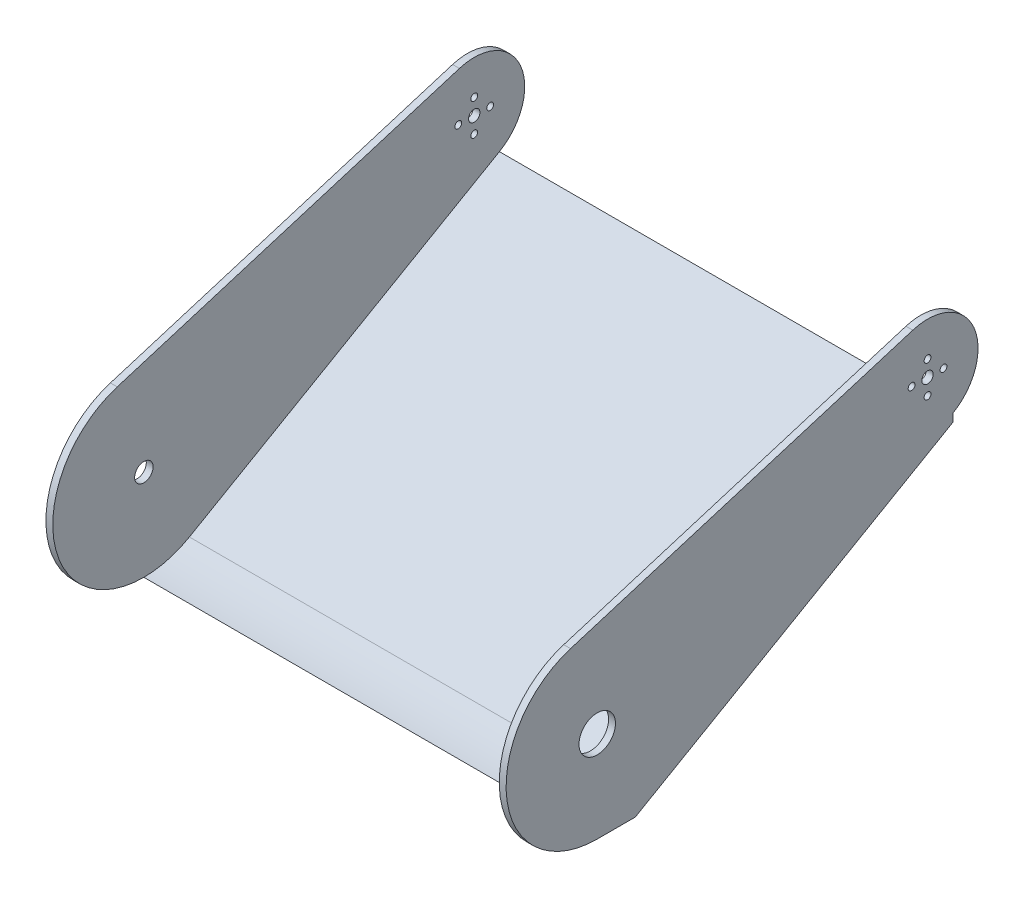
ISO-10303-21;
HEADER;
FILE_DESCRIPTION(('STEP AP214'),'2;1');
FILE_NAME('part.step','',(''),(''),'','','');
FILE_SCHEMA(('AUTOMOTIVE_DESIGN { 1 0 10303 214 1 1 1 1 }'));
ENDSEC;
DATA;
#1=APPLICATION_CONTEXT('core data for automotive mechanical design processes');
#2=APPLICATION_PROTOCOL_DEFINITION('international standard','automotive_design',2000,#1);
#3=PRODUCT_CONTEXT('',#1,'mechanical');
#4=PRODUCT('Part','Part','',(#3));
#5=PRODUCT_RELATED_PRODUCT_CATEGORY('part','',(#4));
#6=PRODUCT_DEFINITION_FORMATION('','',#4);
#7=PRODUCT_DEFINITION_CONTEXT('part definition',#1,'design');
#8=PRODUCT_DEFINITION('design','',#6,#7);
#9=PRODUCT_DEFINITION_SHAPE('','',#8);
#10=(LENGTH_UNIT() NAMED_UNIT(*) SI_UNIT(.MILLI.,.METRE.));
#11=(NAMED_UNIT(*) PLANE_ANGLE_UNIT() SI_UNIT($,.RADIAN.));
#12=(NAMED_UNIT(*) SI_UNIT($,.STERADIAN.) SOLID_ANGLE_UNIT());
#13=UNCERTAINTY_MEASURE_WITH_UNIT(LENGTH_MEASURE(1.E-05),#10,'distance_accuracy_value','');
#14=(GEOMETRIC_REPRESENTATION_CONTEXT(3) GLOBAL_UNCERTAINTY_ASSIGNED_CONTEXT((#13)) GLOBAL_UNIT_ASSIGNED_CONTEXT((#10,
#11,#12)) REPRESENTATION_CONTEXT('',''));
#15=CARTESIAN_POINT('',(0.,0.,0.));
#16=DIRECTION('',(0.,0.,1.));
#17=DIRECTION('',(1.,0.,0.));
#18=AXIS2_PLACEMENT_3D('',#15,#16,#17);
#19=CARTESIAN_POINT('',(3.,63.,-145.));
#20=DIRECTION('',(-1.,0.,0.));
#21=DIRECTION('',(0.,0.,1.));
#22=AXIS2_PLACEMENT_3D('',#19,#20,#21);
#23=CYLINDRICAL_SURFACE('',#22,22.1703860683274);
#24=CARTESIAN_POINT('',(0.,63.,-145.));
#25=DIRECTION('',(1.,0.,0.));
#26=DIRECTION('',(0.,0.,-1.));
#27=AXIS2_PLACEMENT_3D('',#24,#25,#26);
#28=CIRCLE('',#27,22.1703860683274);
#29=CARTESIAN_POINT('',(0.,43.7920690464924,-156.071648788865));
#30=VERTEX_POINT('',#29);
#31=CARTESIAN_POINT('',(0.,84.2006679089215,-138.51480928312));
#32=VERTEX_POINT('',#31);
#33=EDGE_CURVE('E249',#30,#32,#28,.T.);
#34=ORIENTED_EDGE('',*,*,#33,.T.);
#35=DIRECTION('',(-1.,0.,0.));
#36=VECTOR('',#35,1.);
#37=CARTESIAN_POINT('',(3.,84.2006679089215,-138.51480928312));
#38=LINE('',#37,#36);
#39=CARTESIAN_POINT('',(3.,84.2006679089215,-138.51480928312));
#40=VERTEX_POINT('',#39);
#41=EDGE_CURVE('E11',#40,#32,#38,.T.);
#42=ORIENTED_EDGE('',*,*,#41,.F.);
#43=CARTESIAN_POINT('',(3.,63.,-145.));
#44=DIRECTION('',(1.,0.,0.));
#45=DIRECTION('',(0.,0.,-1.));
#46=AXIS2_PLACEMENT_3D('',#43,#44,#45);
#47=CIRCLE('',#46,22.1703860683274);
#48=CARTESIAN_POINT('',(3.,43.7920690464924,-156.071648788865));
#49=VERTEX_POINT('',#48);
#50=EDGE_CURVE('E91',#49,#40,#47,.T.);
#51=ORIENTED_EDGE('',*,*,#50,.F.);
#52=DIRECTION('',(-1.,0.,0.));
#53=VECTOR('',#52,1.);
#54=CARTESIAN_POINT('',(3.,43.7920690464924,-156.071648788865));
#55=LINE('',#54,#53);
#56=EDGE_CURVE('E87',#49,#30,#55,.T.);
#57=ORIENTED_EDGE('',*,*,#56,.T.);
#58=EDGE_LOOP('',(#34,#42,#51,#57));
#59=FACE_BOUND('',#58,.T.);
#60=ADVANCED_FACE('F39',(#59),#23,.T.);
#61=CARTESIAN_POINT('',(3.,38.2504262101395,11.7006365101509));
#62=DIRECTION('',(0.,0.956260655253487,0.292515912753773));
#63=DIRECTION('',(0.,-0.292515912753773,0.956260655253487));
#64=AXIS2_PLACEMENT_3D('',#61,#62,#63);
#65=PLANE('',#64);
#66=DIRECTION('',(0.,0.292515912753773,-0.956260655253487));
#67=VECTOR('',#66,1.);
#68=CARTESIAN_POINT('',(0.,38.2504262101395,11.7006365101509));
#69=LINE('',#68,#67);
#70=CARTESIAN_POINT('',(0.,38.2504262101395,11.7006365101509));
#71=VERTEX_POINT('',#70);
#72=EDGE_CURVE('E251',#71,#32,#69,.T.);
#73=ORIENTED_EDGE('',*,*,#72,.F.);
#74=DIRECTION('',(-1.,0.,0.));
#75=VECTOR('',#74,1.);
#76=CARTESIAN_POINT('',(3.,38.2504262101395,11.7006365101509));
#77=LINE('',#76,#75);
#78=CARTESIAN_POINT('',(3.,38.2504262101395,11.7006365101509));
#79=VERTEX_POINT('',#78);
#80=EDGE_CURVE('E48',#79,#71,#77,.T.);
#81=ORIENTED_EDGE('',*,*,#80,.F.);
#82=DIRECTION('',(0.,0.292515912753773,-0.956260655253487));
#83=VECTOR('',#82,1.);
#84=CARTESIAN_POINT('',(3.,38.2504262101395,11.7006365101509));
#85=LINE('',#84,#83);
#86=EDGE_CURVE('E230',#79,#40,#85,.T.);
#87=ORIENTED_EDGE('',*,*,#86,.T.);
#88=ORIENTED_EDGE('',*,*,#41,.T.);
#89=EDGE_LOOP('',(#73,#81,#87,#88));
#90=FACE_BOUND('',#89,.T.);
#91=ADVANCED_FACE('F280',(#90),#65,.T.);
#92=CARTESIAN_POINT('',(3.,0.,0.));
#93=DIRECTION('',(-1.,0.,0.));
#94=DIRECTION('',(0.,0.,1.));
#95=AXIS2_PLACEMENT_3D('',#92,#93,#94);
#96=CYLINDRICAL_SURFACE('',#95,40.);
#97=CARTESIAN_POINT('',(0.,0.,0.));
#98=DIRECTION('',(1.,0.,0.));
#99=DIRECTION('',(0.,0.,-1.));
#100=AXIS2_PLACEMENT_3D('',#97,#98,#99);
#101=CIRCLE('',#100,40.);
#102=CARTESIAN_POINT('',(0.,-40.,0.));
#103=VERTEX_POINT('',#102);
#104=EDGE_CURVE('E254',#71,#103,#101,.T.);
#105=ORIENTED_EDGE('',*,*,#104,.T.);
#106=DIRECTION('',(-1.,0.,0.));
#107=VECTOR('',#106,1.);
#108=CARTESIAN_POINT('',(3.,-40.,0.));
#109=LINE('',#108,#107);
#110=CARTESIAN_POINT('',(3.,-40.,0.));
#111=VERTEX_POINT('',#110);
#112=EDGE_CURVE('E267',#111,#103,#109,.T.);
#113=ORIENTED_EDGE('',*,*,#112,.F.);
#114=CARTESIAN_POINT('',(3.,0.,0.));
#115=DIRECTION('',(1.,0.,0.));
#116=DIRECTION('',(0.,0.,-1.));
#117=AXIS2_PLACEMENT_3D('',#114,#115,#116);
#118=CIRCLE('',#117,40.);
#119=EDGE_CURVE('E233',#79,#111,#118,.T.);
#120=ORIENTED_EDGE('',*,*,#119,.F.);
#121=ORIENTED_EDGE('',*,*,#80,.T.);
#122=EDGE_LOOP('',(#105,#113,#120,#121));
#123=FACE_BOUND('',#122,.T.);
#124=ADVANCED_FACE('F272',(#123),#96,.T.);
#125=CARTESIAN_POINT('',(3.,-40.,0.));
#126=DIRECTION('',(0.,1.,0.));
#127=DIRECTION('',(0.,0.,1.));
#128=AXIS2_PLACEMENT_3D('',#125,#126,#127);
#129=PLANE('',#128);
#130=DIRECTION('',(0.,0.,-1.));
#131=VECTOR('',#130,1.);
#132=CARTESIAN_POINT('',(0.,-40.,0.));
#133=LINE('',#132,#131);
#134=CARTESIAN_POINT('',(0.,-40.,-16.7101907155731));
#135=VERTEX_POINT('',#134);
#136=EDGE_CURVE('E256',#103,#135,#133,.T.);
#137=ORIENTED_EDGE('',*,*,#136,.T.);
#138=DIRECTION('',(-1.,0.,0.));
#139=VECTOR('',#138,1.);
#140=CARTESIAN_POINT('',(3.,-40.,-16.7101907155731));
#141=LINE('',#140,#139);
#142=CARTESIAN_POINT('',(202.,-40.,-16.7101907155731));
#143=VERTEX_POINT('',#142);
#144=EDGE_CURVE('E264',#143,#135,#141,.T.);
#145=ORIENTED_EDGE('',*,*,#144,.F.);
#146=DIRECTION('',(0.,0.,-1.));
#147=VECTOR('',#146,1.);
#148=CARTESIAN_POINT('',(202.,-40.,0.));
#149=LINE('',#148,#147);
#150=CARTESIAN_POINT('',(202.,-40.,0.));
#151=VERTEX_POINT('',#150);
#152=EDGE_CURVE('E185',#151,#143,#149,.T.);
#153=ORIENTED_EDGE('',*,*,#152,.F.);
#154=DIRECTION('',(1.,0.,0.));
#155=VECTOR('',#154,1.);
#156=CARTESIAN_POINT('',(199.,-40.,0.));
#157=LINE('',#156,#155);
#158=CARTESIAN_POINT('',(199.,-40.,0.));
#159=VERTEX_POINT('',#158);
#160=EDGE_CURVE('E140',#159,#151,#157,.T.);
#161=ORIENTED_EDGE('',*,*,#160,.F.);
#162=DIRECTION('',(-1.,0.,0.));
#163=VECTOR('',#162,1.);
#164=CARTESIAN_POINT('',(199.,-40.,0.));
#165=LINE('',#164,#163);
#166=EDGE_CURVE('E209',#159,#111,#165,.T.);
#167=ORIENTED_EDGE('',*,*,#166,.T.);
#168=ORIENTED_EDGE('',*,*,#112,.T.);
#169=EDGE_LOOP('',(#137,#145,#153,#161,#167,#168));
#170=FACE_BOUND('',#169,.T.);
#171=ADVANCED_FACE('F298',(#170),#129,.F.);
#172=CARTESIAN_POINT('',(3.,-37.2542466538625,-21.473730608657));
#173=DIRECTION('',(0.,0.866377829159594,0.499389083922256));
#174=DIRECTION('',(0.,-0.499389083922256,0.866377829159594));
#175=AXIS2_PLACEMENT_3D('',#172,#173,#174);
#176=PLANE('',#175);
#177=DIRECTION('',(0.,0.499389083922256,-0.866377829159594));
#178=VECTOR('',#177,1.);
#179=CARTESIAN_POINT('',(0.,-37.2542466538625,-21.473730608657));
#180=LINE('',#179,#178);
#181=CARTESIAN_POINT('',(0.,40.3293765594166,-156.071648788865));
#182=VERTEX_POINT('',#181);
#183=EDGE_CURVE('E258',#135,#182,#180,.T.);
#184=ORIENTED_EDGE('',*,*,#183,.T.);
#185=DIRECTION('',(-1.,0.,0.));
#186=VECTOR('',#185,1.);
#187=CARTESIAN_POINT('',(3.,40.3293765594166,-156.071648788865));
#188=LINE('',#187,#186);
#189=CARTESIAN_POINT('',(202.,40.3293765594166,-156.071648788865));
#190=VERTEX_POINT('',#189);
#191=EDGE_CURVE('E80',#190,#182,#188,.T.);
#192=ORIENTED_EDGE('',*,*,#191,.F.);
#193=DIRECTION('',(0.,0.499389083922256,-0.866377829159594));
#194=VECTOR('',#193,1.);
#195=CARTESIAN_POINT('',(202.,-37.2542466538625,-21.473730608657));
#196=LINE('',#195,#194);
#197=EDGE_CURVE('E182',#143,#190,#196,.T.);
#198=ORIENTED_EDGE('',*,*,#197,.F.);
#199=ORIENTED_EDGE('',*,*,#144,.T.);
#200=EDGE_LOOP('',(#184,#192,#198,#199));
#201=FACE_BOUND('',#200,.T.);
#202=ADVANCED_FACE('F296',(#201),#176,.F.);
#203=CARTESIAN_POINT('',(3.,0.,-156.071648788865));
#204=DIRECTION('',(0.,0.,-1.));
#205=DIRECTION('',(-1.,0.,0.));
#206=AXIS2_PLACEMENT_3D('',#203,#204,#205);
#207=PLANE('',#206);
#208=DIRECTION('',(0.,-1.,0.));
#209=VECTOR('',#208,1.);
#210=CARTESIAN_POINT('',(0.,0.,-156.071648788865));
#211=LINE('',#210,#209);
#212=EDGE_CURVE('E217',#30,#182,#211,.T.);
#213=ORIENTED_EDGE('',*,*,#212,.F.);
#214=ORIENTED_EDGE('',*,*,#56,.F.);
#215=DIRECTION('',(-1.,0.,0.));
#216=VECTOR('',#215,1.);
#217=CARTESIAN_POINT('',(199.,43.7920690464924,-156.071648788865));
#218=LINE('',#217,#216);
#219=CARTESIAN_POINT('',(199.,43.7920690464924,-156.071648788865));
#220=VERTEX_POINT('',#219);
#221=EDGE_CURVE('E206',#220,#49,#218,.T.);
#222=ORIENTED_EDGE('',*,*,#221,.F.);
#223=DIRECTION('',(1.,0.,0.));
#224=VECTOR('',#223,1.);
#225=CARTESIAN_POINT('',(199.,43.7920690464924,-156.071648788865));
#226=LINE('',#225,#224);
#227=CARTESIAN_POINT('',(202.,43.7920690464924,-156.071648788865));
#228=VERTEX_POINT('',#227);
#229=EDGE_CURVE('E194',#220,#228,#226,.T.);
#230=ORIENTED_EDGE('',*,*,#229,.T.);
#231=DIRECTION('',(0.,-1.,0.));
#232=VECTOR('',#231,1.);
#233=CARTESIAN_POINT('',(202.,0.,-156.071648788865));
#234=LINE('',#233,#232);
#235=EDGE_CURVE('E180',#228,#190,#234,.T.);
#236=ORIENTED_EDGE('',*,*,#235,.T.);
#237=ORIENTED_EDGE('',*,*,#191,.T.);
#238=EDGE_LOOP('',(#213,#214,#222,#230,#236,#237));
#239=FACE_BOUND('',#238,.T.);
#240=ADVANCED_FACE('F281',(#239),#207,.T.);
#241=CARTESIAN_POINT('',(3.,63.,-145.));
#242=DIRECTION('',(-1.,0.,0.));
#243=DIRECTION('',(0.,0.,1.));
#244=AXIS2_PLACEMENT_3D('',#241,#242,#243);
#245=CYLINDRICAL_SURFACE('',#244,2.5);
#246=CARTESIAN_POINT('',(3.,63.,-145.));
#247=DIRECTION('',(1.,0.,0.));
#248=DIRECTION('',(0.,0.,-1.));
#249=AXIS2_PLACEMENT_3D('',#246,#247,#248);
#250=CIRCLE('',#249,2.5);
#251=CARTESIAN_POINT('',(3.,63.,-147.5));
#252=VERTEX_POINT('',#251);
#253=EDGE_CURVE('E226',#252,#252,#250,.T.);
#254=ORIENTED_EDGE('',*,*,#253,.T.);
#255=EDGE_LOOP('',(#254));
#256=FACE_BOUND('',#255,.T.);
#257=CARTESIAN_POINT('',(0.,63.,-145.));
#258=DIRECTION('',(1.,0.,0.));
#259=DIRECTION('',(0.,0.,-1.));
#260=AXIS2_PLACEMENT_3D('',#257,#258,#259);
#261=CIRCLE('',#260,2.5);
#262=CARTESIAN_POINT('',(0.,63.,-147.5));
#263=VERTEX_POINT('',#262);
#264=EDGE_CURVE('E246',#263,#263,#261,.T.);
#265=ORIENTED_EDGE('',*,*,#264,.F.);
#266=EDGE_LOOP('',(#265));
#267=FACE_BOUND('',#266,.T.);
#268=ADVANCED_FACE('F316',(#256,#267),#245,.F.);
#269=CARTESIAN_POINT('',(3.,70.,-145.));
#270=DIRECTION('',(-1.,0.,0.));
#271=DIRECTION('',(0.,0.,1.));
#272=AXIS2_PLACEMENT_3D('',#269,#270,#271);
#273=CYLINDRICAL_SURFACE('',#272,1.5);
#274=CARTESIAN_POINT('',(3.,70.,-145.));
#275=DIRECTION('',(1.,0.,0.));
#276=DIRECTION('',(0.,0.,-1.));
#277=AXIS2_PLACEMENT_3D('',#274,#275,#276);
#278=CIRCLE('',#277,1.5);
#279=CARTESIAN_POINT('',(3.,70.,-146.5));
#280=VERTEX_POINT('',#279);
#281=EDGE_CURVE('E223',#280,#280,#278,.T.);
#282=ORIENTED_EDGE('',*,*,#281,.T.);
#283=EDGE_LOOP('',(#282));
#284=FACE_BOUND('',#283,.T.);
#285=CARTESIAN_POINT('',(0.,70.,-145.));
#286=DIRECTION('',(1.,0.,0.));
#287=DIRECTION('',(0.,0.,-1.));
#288=AXIS2_PLACEMENT_3D('',#285,#286,#287);
#289=CIRCLE('',#288,1.5);
#290=CARTESIAN_POINT('',(0.,70.,-146.5));
#291=VERTEX_POINT('',#290);
#292=EDGE_CURVE('E243',#291,#291,#289,.T.);
#293=ORIENTED_EDGE('',*,*,#292,.F.);
#294=EDGE_LOOP('',(#293));
#295=FACE_BOUND('',#294,.T.);
#296=ADVANCED_FACE('F319',(#284,#295),#273,.F.);
#297=CARTESIAN_POINT('',(3.,63.,-152.));
#298=DIRECTION('',(-1.,0.,0.));
#299=DIRECTION('',(0.,0.,1.));
#300=AXIS2_PLACEMENT_3D('',#297,#298,#299);
#301=CYLINDRICAL_SURFACE('',#300,1.5);
#302=CARTESIAN_POINT('',(3.,63.,-152.));
#303=DIRECTION('',(1.,0.,0.));
#304=DIRECTION('',(0.,0.,-1.));
#305=AXIS2_PLACEMENT_3D('',#302,#303,#304);
#306=CIRCLE('',#305,1.5);
#307=CARTESIAN_POINT('',(3.,63.,-153.5));
#308=VERTEX_POINT('',#307);
#309=EDGE_CURVE('E220',#308,#308,#306,.T.);
#310=ORIENTED_EDGE('',*,*,#309,.T.);
#311=EDGE_LOOP('',(#310));
#312=FACE_BOUND('',#311,.T.);
#313=CARTESIAN_POINT('',(0.,63.,-152.));
#314=DIRECTION('',(1.,0.,0.));
#315=DIRECTION('',(0.,0.,-1.));
#316=AXIS2_PLACEMENT_3D('',#313,#314,#315);
#317=CIRCLE('',#316,1.5);
#318=CARTESIAN_POINT('',(0.,63.,-153.5));
#319=VERTEX_POINT('',#318);
#320=EDGE_CURVE('E240',#319,#319,#317,.T.);
#321=ORIENTED_EDGE('',*,*,#320,.F.);
#322=EDGE_LOOP('',(#321));
#323=FACE_BOUND('',#322,.T.);
#324=ADVANCED_FACE('F343',(#312,#323),#301,.F.);
#325=CARTESIAN_POINT('',(3.,56.,-145.));
#326=DIRECTION('',(-1.,0.,0.));
#327=DIRECTION('',(0.,0.,1.));
#328=AXIS2_PLACEMENT_3D('',#325,#326,#327);
#329=CYLINDRICAL_SURFACE('',#328,1.5);
#330=CARTESIAN_POINT('',(3.,56.,-145.));
#331=DIRECTION('',(1.,0.,0.));
#332=DIRECTION('',(0.,0.,-1.));
#333=AXIS2_PLACEMENT_3D('',#330,#331,#332);
#334=CIRCLE('',#333,1.5);
#335=CARTESIAN_POINT('',(3.,56.,-146.5));
#336=VERTEX_POINT('',#335);
#337=EDGE_CURVE('E216',#336,#336,#334,.T.);
#338=ORIENTED_EDGE('',*,*,#337,.T.);
#339=EDGE_LOOP('',(#338));
#340=FACE_BOUND('',#339,.T.);
#341=CARTESIAN_POINT('',(0.,56.,-145.));
#342=DIRECTION('',(1.,0.,0.));
#343=DIRECTION('',(0.,0.,-1.));
#344=AXIS2_PLACEMENT_3D('',#341,#342,#343);
#345=CIRCLE('',#344,1.5);
#346=CARTESIAN_POINT('',(0.,56.,-146.5));
#347=VERTEX_POINT('',#346);
#348=EDGE_CURVE('E237',#347,#347,#345,.T.);
#349=ORIENTED_EDGE('',*,*,#348,.F.);
#350=EDGE_LOOP('',(#349));
#351=FACE_BOUND('',#350,.T.);
#352=ADVANCED_FACE('F346',(#340,#351),#329,.F.);
#353=CARTESIAN_POINT('',(3.,62.9999999999999,-138.));
#354=DIRECTION('',(-1.,0.,0.));
#355=DIRECTION('',(0.,0.,1.));
#356=AXIS2_PLACEMENT_3D('',#353,#354,#355);
#357=CYLINDRICAL_SURFACE('',#356,1.50000000000003);
#358=CARTESIAN_POINT('',(3.,62.9999999999999,-138.));
#359=DIRECTION('',(1.,0.,0.));
#360=DIRECTION('',(0.,0.,-1.));
#361=AXIS2_PLACEMENT_3D('',#358,#359,#360);
#362=CIRCLE('',#361,1.50000000000003);
#363=CARTESIAN_POINT('',(3.,62.9999999999999,-139.5));
#364=VERTEX_POINT('',#363);
#365=EDGE_CURVE('E213',#364,#364,#362,.T.);
#366=ORIENTED_EDGE('',*,*,#365,.T.);
#367=EDGE_LOOP('',(#366));
#368=FACE_BOUND('',#367,.T.);
#369=CARTESIAN_POINT('',(0.,62.9999999999999,-138.));
#370=DIRECTION('',(1.,0.,0.));
#371=DIRECTION('',(0.,0.,-1.));
#372=AXIS2_PLACEMENT_3D('',#369,#370,#371);
#373=CIRCLE('',#372,1.50000000000003);
#374=CARTESIAN_POINT('',(0.,62.9999999999999,-139.5));
#375=VERTEX_POINT('',#374);
#376=EDGE_CURVE('E212',#375,#375,#373,.T.);
#377=ORIENTED_EDGE('',*,*,#376,.F.);
#378=EDGE_LOOP('',(#377));
#379=FACE_BOUND('',#378,.T.);
#380=ADVANCED_FACE('F41',(#368,#379),#357,.F.);
#381=CARTESIAN_POINT('',(3.,0.,0.));
#382=DIRECTION('',(1.,0.,0.));
#383=DIRECTION('',(0.,0.,-1.));
#384=AXIS2_PLACEMENT_3D('',#381,#382,#383);
#385=PLANE('',#384);
#386=CARTESIAN_POINT('',(3.,0.,0.));
#387=DIRECTION('',(1.,0.,0.));
#388=DIRECTION('',(0.,0.,-1.));
#389=AXIS2_PLACEMENT_3D('',#386,#387,#388);
#390=CIRCLE('',#389,4.05);
#391=CARTESIAN_POINT('',(3.,0.,-4.05));
#392=VERTEX_POINT('',#391);
#393=EDGE_CURVE('E706',#392,#392,#390,.T.);
#394=ORIENTED_EDGE('',*,*,#393,.F.);
#395=EDGE_LOOP('',(#394));
#396=FACE_BOUND('',#395,.T.);
#397=CARTESIAN_POINT('',(3.,0.,0.));
#398=DIRECTION('',(-1.,0.,0.));
#399=DIRECTION('',(0.,0.,-1.));
#400=AXIS2_PLACEMENT_3D('',#397,#398,#399);
#401=CIRCLE('',#400,40.);
#402=CARTESIAN_POINT('',(3.,-34.6551131663837,-19.9755633568902));
#403=VERTEX_POINT('',#402);
#404=EDGE_CURVE('E196',#403,#111,#401,.T.);
#405=ORIENTED_EDGE('',*,*,#404,.F.);
#406=DIRECTION('',(0.,-0.499389083922255,0.866377829159594));
#407=VECTOR('',#406,1.);
#408=CARTESIAN_POINT('',(3.,43.7920690464924,-156.071648788865));
#409=LINE('',#408,#407);
#410=EDGE_CURVE('E56',#49,#403,#409,.T.);
#411=ORIENTED_EDGE('',*,*,#410,.F.);
#412=ORIENTED_EDGE('',*,*,#50,.T.);
#413=ORIENTED_EDGE('',*,*,#86,.F.);
#414=ORIENTED_EDGE('',*,*,#119,.T.);
#415=EDGE_LOOP('',(#405,#411,#412,#413,#414));
#416=FACE_BOUND('',#415,.T.);
#417=ORIENTED_EDGE('',*,*,#365,.F.);
#418=EDGE_LOOP('',(#417));
#419=FACE_BOUND('',#418,.T.);
#420=ORIENTED_EDGE('',*,*,#337,.F.);
#421=EDGE_LOOP('',(#420));
#422=FACE_BOUND('',#421,.T.);
#423=ORIENTED_EDGE('',*,*,#309,.F.);
#424=EDGE_LOOP('',(#423));
#425=FACE_BOUND('',#424,.T.);
#426=ORIENTED_EDGE('',*,*,#281,.F.);
#427=EDGE_LOOP('',(#426));
#428=FACE_BOUND('',#427,.T.);
#429=ORIENTED_EDGE('',*,*,#253,.F.);
#430=EDGE_LOOP('',(#429));
#431=FACE_BOUND('',#430,.T.);
#432=ADVANCED_FACE('F301',(#396,#416,#419,#422,#425,#428,#431),#385,.T.);
#433=CARTESIAN_POINT('',(0.,0.,0.));
#434=DIRECTION('',(1.,0.,0.));
#435=DIRECTION('',(0.,0.,-1.));
#436=AXIS2_PLACEMENT_3D('',#433,#434,#435);
#437=PLANE('',#436);
#438=CARTESIAN_POINT('',(0.,0.,0.));
#439=DIRECTION('',(-1.,0.,0.));
#440=DIRECTION('',(0.,0.,1.));
#441=AXIS2_PLACEMENT_3D('',#438,#439,#440);
#442=CIRCLE('',#441,4.05);
#443=CARTESIAN_POINT('',(0.,0.,4.05));
#444=VERTEX_POINT('',#443);
#445=EDGE_CURVE('E709',#444,#444,#442,.T.);
#446=ORIENTED_EDGE('',*,*,#445,.F.);
#447=EDGE_LOOP('',(#446));
#448=FACE_BOUND('',#447,.T.);
#449=ORIENTED_EDGE('',*,*,#376,.T.);
#450=EDGE_LOOP('',(#449));
#451=FACE_BOUND('',#450,.T.);
#452=ORIENTED_EDGE('',*,*,#348,.T.);
#453=EDGE_LOOP('',(#452));
#454=FACE_BOUND('',#453,.T.);
#455=ORIENTED_EDGE('',*,*,#320,.T.);
#456=EDGE_LOOP('',(#455));
#457=FACE_BOUND('',#456,.T.);
#458=ORIENTED_EDGE('',*,*,#292,.T.);
#459=EDGE_LOOP('',(#458));
#460=FACE_BOUND('',#459,.T.);
#461=ORIENTED_EDGE('',*,*,#264,.T.);
#462=EDGE_LOOP('',(#461));
#463=FACE_BOUND('',#462,.T.);
#464=ORIENTED_EDGE('',*,*,#33,.F.);
#465=ORIENTED_EDGE('',*,*,#212,.T.);
#466=ORIENTED_EDGE('',*,*,#183,.F.);
#467=ORIENTED_EDGE('',*,*,#136,.F.);
#468=ORIENTED_EDGE('',*,*,#104,.F.);
#469=ORIENTED_EDGE('',*,*,#72,.T.);
#470=EDGE_LOOP('',(#464,#465,#466,#467,#468,#469));
#471=FACE_BOUND('',#470,.T.);
#472=ADVANCED_FACE('F278',(#448,#451,#454,#457,#460,#463,#471),#437,.F.);
#473=CARTESIAN_POINT('',(199.,0.,0.));
#474=DIRECTION('',(-1.,0.,0.));
#475=DIRECTION('',(0.,0.,1.));
#476=AXIS2_PLACEMENT_3D('',#473,#474,#475);
#477=CYLINDRICAL_SURFACE('',#476,40.);
#478=ORIENTED_EDGE('',*,*,#404,.T.);
#479=ORIENTED_EDGE('',*,*,#166,.F.);
#480=CARTESIAN_POINT('',(199.,0.,0.));
#481=DIRECTION('',(-1.,0.,0.));
#482=DIRECTION('',(0.,0.,-1.));
#483=AXIS2_PLACEMENT_3D('',#480,#481,#482);
#484=CIRCLE('',#483,40.);
#485=CARTESIAN_POINT('',(199.,-34.6551131663837,-19.9755633568902));
#486=VERTEX_POINT('',#485);
#487=EDGE_CURVE('E153',#486,#159,#484,.T.);
#488=ORIENTED_EDGE('',*,*,#487,.F.);
#489=DIRECTION('',(-1.,0.,0.));
#490=VECTOR('',#489,1.);
#491=CARTESIAN_POINT('',(199.,-34.6551131663837,-19.9755633568902));
#492=LINE('',#491,#490);
#493=EDGE_CURVE('E200',#486,#403,#492,.T.);
#494=ORIENTED_EDGE('',*,*,#493,.T.);
#495=EDGE_LOOP('',(#478,#479,#488,#494));
#496=FACE_BOUND('',#495,.T.);
#497=ADVANCED_FACE('F300',(#496),#477,.F.);
#498=CARTESIAN_POINT('',(199.,43.7920690464924,-156.071648788865));
#499=DIRECTION('',(0.,-0.866377829159594,-0.499389083922256));
#500=DIRECTION('',(0.,0.499389083922256,-0.866377829159594));
#501=AXIS2_PLACEMENT_3D('',#498,#499,#500);
#502=PLANE('',#501);
#503=ORIENTED_EDGE('',*,*,#410,.T.);
#504=ORIENTED_EDGE('',*,*,#493,.F.);
#505=DIRECTION('',(0.,-0.499389083922255,0.866377829159594));
#506=VECTOR('',#505,1.);
#507=CARTESIAN_POINT('',(199.,43.7920690464924,-156.071648788865));
#508=LINE('',#507,#506);
#509=EDGE_CURVE('E198',#220,#486,#508,.T.);
#510=ORIENTED_EDGE('',*,*,#509,.F.);
#511=ORIENTED_EDGE('',*,*,#221,.T.);
#512=EDGE_LOOP('',(#503,#504,#510,#511));
#513=FACE_BOUND('',#512,.T.);
#514=ADVANCED_FACE('F284',(#513),#502,.F.);
#515=CARTESIAN_POINT('',(199.,63.,-145.));
#516=DIRECTION('',(1.,0.,0.));
#517=DIRECTION('',(0.,0.,-1.));
#518=AXIS2_PLACEMENT_3D('',#515,#516,#517);
#519=CYLINDRICAL_SURFACE('',#518,22.1703860683274);
#520=CARTESIAN_POINT('',(202.,63.,-145.));
#521=DIRECTION('',(1.,0.,0.));
#522=DIRECTION('',(0.,0.,-1.));
#523=AXIS2_PLACEMENT_3D('',#520,#521,#522);
#524=CIRCLE('',#523,22.1703860683274);
#525=CARTESIAN_POINT('',(202.,84.2006679089215,-138.51480928312));
#526=VERTEX_POINT('',#525);
#527=EDGE_CURVE('E177',#228,#526,#524,.T.);
#528=ORIENTED_EDGE('',*,*,#527,.F.);
#529=ORIENTED_EDGE('',*,*,#229,.F.);
#530=CARTESIAN_POINT('',(199.,63.,-145.));
#531=DIRECTION('',(1.,0.,0.));
#532=DIRECTION('',(0.,0.,-1.));
#533=AXIS2_PLACEMENT_3D('',#530,#531,#532);
#534=CIRCLE('',#533,22.1703860683274);
#535=CARTESIAN_POINT('',(199.,84.2006679089215,-138.51480928312));
#536=VERTEX_POINT('',#535);
#537=EDGE_CURVE('E155',#220,#536,#534,.T.);
#538=ORIENTED_EDGE('',*,*,#537,.T.);
#539=DIRECTION('',(1.,0.,0.));
#540=VECTOR('',#539,1.);
#541=CARTESIAN_POINT('',(199.,84.2006679089215,-138.51480928312));
#542=LINE('',#541,#540);
#543=EDGE_CURVE('E141',#536,#526,#542,.T.);
#544=ORIENTED_EDGE('',*,*,#543,.T.);
#545=EDGE_LOOP('',(#528,#529,#538,#544));
#546=FACE_BOUND('',#545,.T.);
#547=ADVANCED_FACE('F289',(#546),#519,.T.);
#548=CARTESIAN_POINT('',(199.,0.,0.));
#549=DIRECTION('',(1.,0.,0.));
#550=DIRECTION('',(0.,0.,-1.));
#551=AXIS2_PLACEMENT_3D('',#548,#549,#550);
#552=CYLINDRICAL_SURFACE('',#551,40.);
#553=CARTESIAN_POINT('',(202.,0.,0.));
#554=DIRECTION('',(1.,0.,0.));
#555=DIRECTION('',(0.,0.,-1.));
#556=AXIS2_PLACEMENT_3D('',#553,#554,#555);
#557=CIRCLE('',#556,40.);
#558=CARTESIAN_POINT('',(202.,38.2504262101395,11.7006365101509));
#559=VERTEX_POINT('',#558);
#560=EDGE_CURVE('E136',#559,#151,#557,.T.);
#561=ORIENTED_EDGE('',*,*,#560,.F.);
#562=DIRECTION('',(1.,0.,0.));
#563=VECTOR('',#562,1.);
#564=CARTESIAN_POINT('',(199.,38.2504262101395,11.7006365101509));
#565=LINE('',#564,#563);
#566=CARTESIAN_POINT('',(199.,38.2504262101395,11.7006365101509));
#567=VERTEX_POINT('',#566);
#568=EDGE_CURVE('E130',#567,#559,#565,.T.);
#569=ORIENTED_EDGE('',*,*,#568,.F.);
#570=CARTESIAN_POINT('',(199.,0.,0.));
#571=DIRECTION('',(1.,0.,0.));
#572=DIRECTION('',(0.,0.,-1.));
#573=AXIS2_PLACEMENT_3D('',#570,#571,#572);
#574=CIRCLE('',#573,40.);
#575=EDGE_CURVE('E134',#567,#159,#574,.T.);
#576=ORIENTED_EDGE('',*,*,#575,.T.);
#577=ORIENTED_EDGE('',*,*,#160,.T.);
#578=EDGE_LOOP('',(#561,#569,#576,#577));
#579=FACE_BOUND('',#578,.T.);
#580=ADVANCED_FACE('F132',(#579),#552,.T.);
#581=CARTESIAN_POINT('',(199.,38.2504262101395,11.7006365101509));
#582=DIRECTION('',(0.,-0.956260655253487,-0.292515912753773));
#583=DIRECTION('',(0.,0.292515912753773,-0.956260655253487));
#584=AXIS2_PLACEMENT_3D('',#581,#582,#583);
#585=PLANE('',#584);
#586=DIRECTION('',(0.,0.292515912753773,-0.956260655253487));
#587=VECTOR('',#586,1.);
#588=CARTESIAN_POINT('',(202.,38.2504262101395,11.7006365101509));
#589=LINE('',#588,#587);
#590=EDGE_CURVE('E189',#559,#526,#589,.T.);
#591=ORIENTED_EDGE('',*,*,#590,.T.);
#592=ORIENTED_EDGE('',*,*,#543,.F.);
#593=DIRECTION('',(0.,0.292515912753773,-0.956260655253487));
#594=VECTOR('',#593,1.);
#595=CARTESIAN_POINT('',(199.,38.2504262101395,11.7006365101509));
#596=LINE('',#595,#594);
#597=EDGE_CURVE('E144',#567,#536,#596,.T.);
#598=ORIENTED_EDGE('',*,*,#597,.F.);
#599=ORIENTED_EDGE('',*,*,#568,.T.);
#600=EDGE_LOOP('',(#591,#592,#598,#599));
#601=FACE_BOUND('',#600,.T.);
#602=ADVANCED_FACE('F145',(#601),#585,.F.);
#603=CARTESIAN_POINT('',(199.,63.,-145.));
#604=DIRECTION('',(1.,0.,0.));
#605=DIRECTION('',(0.,0.,-1.));
#606=AXIS2_PLACEMENT_3D('',#603,#604,#605);
#607=CYLINDRICAL_SURFACE('',#606,2.5);
#608=CARTESIAN_POINT('',(199.,63.,-145.));
#609=DIRECTION('',(1.,0.,0.));
#610=DIRECTION('',(0.,0.,-1.));
#611=AXIS2_PLACEMENT_3D('',#608,#609,#610);
#612=CIRCLE('',#611,2.5);
#613=CARTESIAN_POINT('',(199.,63.,-147.5));
#614=VERTEX_POINT('',#613);
#615=EDGE_CURVE('E157',#614,#614,#612,.T.);
#616=ORIENTED_EDGE('',*,*,#615,.F.);
#617=EDGE_LOOP('',(#616));
#618=FACE_BOUND('',#617,.T.);
#619=CARTESIAN_POINT('',(202.,63.,-145.));
#620=DIRECTION('',(1.,0.,0.));
#621=DIRECTION('',(0.,0.,-1.));
#622=AXIS2_PLACEMENT_3D('',#619,#620,#621);
#623=CIRCLE('',#622,2.5);
#624=CARTESIAN_POINT('',(202.,63.,-147.5));
#625=VERTEX_POINT('',#624);
#626=EDGE_CURVE('E174',#625,#625,#623,.T.);
#627=ORIENTED_EDGE('',*,*,#626,.T.);
#628=EDGE_LOOP('',(#627));
#629=FACE_BOUND('',#628,.T.);
#630=ADVANCED_FACE('F445',(#618,#629),#607,.F.);
#631=CARTESIAN_POINT('',(199.,70.,-145.));
#632=DIRECTION('',(1.,0.,0.));
#633=DIRECTION('',(0.,0.,-1.));
#634=AXIS2_PLACEMENT_3D('',#631,#632,#633);
#635=CYLINDRICAL_SURFACE('',#634,1.5);
#636=CARTESIAN_POINT('',(199.,70.,-145.));
#637=DIRECTION('',(1.,0.,0.));
#638=DIRECTION('',(0.,0.,-1.));
#639=AXIS2_PLACEMENT_3D('',#636,#637,#638);
#640=CIRCLE('',#639,1.5);
#641=CARTESIAN_POINT('',(199.,70.,-146.5));
#642=VERTEX_POINT('',#641);
#643=EDGE_CURVE('E689',#642,#642,#640,.T.);
#644=ORIENTED_EDGE('',*,*,#643,.F.);
#645=EDGE_LOOP('',(#644));
#646=FACE_BOUND('',#645,.T.);
#647=CARTESIAN_POINT('',(202.,70.,-145.));
#648=DIRECTION('',(1.,0.,0.));
#649=DIRECTION('',(0.,0.,-1.));
#650=AXIS2_PLACEMENT_3D('',#647,#648,#649);
#651=CIRCLE('',#650,1.5);
#652=CARTESIAN_POINT('',(202.,70.,-146.5));
#653=VERTEX_POINT('',#652);
#654=EDGE_CURVE('E171',#653,#653,#651,.T.);
#655=ORIENTED_EDGE('',*,*,#654,.T.);
#656=EDGE_LOOP('',(#655));
#657=FACE_BOUND('',#656,.T.);
#658=ADVANCED_FACE('F437',(#646,#657),#635,.F.);
#659=CARTESIAN_POINT('',(199.,63.,-152.));
#660=DIRECTION('',(1.,0.,0.));
#661=DIRECTION('',(0.,0.,-1.));
#662=AXIS2_PLACEMENT_3D('',#659,#660,#661);
#663=CYLINDRICAL_SURFACE('',#662,1.5);
#664=CARTESIAN_POINT('',(199.,63.,-152.));
#665=DIRECTION('',(1.,0.,0.));
#666=DIRECTION('',(0.,0.,-1.));
#667=AXIS2_PLACEMENT_3D('',#664,#665,#666);
#668=CIRCLE('',#667,1.5);
#669=CARTESIAN_POINT('',(199.,63.,-153.5));
#670=VERTEX_POINT('',#669);
#671=EDGE_CURVE('E691',#670,#670,#668,.T.);
#672=ORIENTED_EDGE('',*,*,#671,.F.);
#673=EDGE_LOOP('',(#672));
#674=FACE_BOUND('',#673,.T.);
#675=CARTESIAN_POINT('',(202.,63.,-152.));
#676=DIRECTION('',(1.,0.,0.));
#677=DIRECTION('',(0.,0.,-1.));
#678=AXIS2_PLACEMENT_3D('',#675,#676,#677);
#679=CIRCLE('',#678,1.5);
#680=CARTESIAN_POINT('',(202.,63.,-153.5));
#681=VERTEX_POINT('',#680);
#682=EDGE_CURVE('E168',#681,#681,#679,.T.);
#683=ORIENTED_EDGE('',*,*,#682,.T.);
#684=EDGE_LOOP('',(#683));
#685=FACE_BOUND('',#684,.T.);
#686=ADVANCED_FACE('F429',(#674,#685),#663,.F.);
#687=CARTESIAN_POINT('',(199.,56.,-145.));
#688=DIRECTION('',(1.,0.,0.));
#689=DIRECTION('',(0.,0.,-1.));
#690=AXIS2_PLACEMENT_3D('',#687,#688,#689);
#691=CYLINDRICAL_SURFACE('',#690,1.5);
#692=CARTESIAN_POINT('',(199.,56.,-145.));
#693=DIRECTION('',(1.,0.,0.));
#694=DIRECTION('',(0.,0.,-1.));
#695=AXIS2_PLACEMENT_3D('',#692,#693,#694);
#696=CIRCLE('',#695,1.5);
#697=CARTESIAN_POINT('',(199.,56.,-146.5));
#698=VERTEX_POINT('',#697);
#699=EDGE_CURVE('E696',#698,#698,#696,.T.);
#700=ORIENTED_EDGE('',*,*,#699,.F.);
#701=EDGE_LOOP('',(#700));
#702=FACE_BOUND('',#701,.T.);
#703=CARTESIAN_POINT('',(202.,56.,-145.));
#704=DIRECTION('',(1.,0.,0.));
#705=DIRECTION('',(0.,0.,-1.));
#706=AXIS2_PLACEMENT_3D('',#703,#704,#705);
#707=CIRCLE('',#706,1.5);
#708=CARTESIAN_POINT('',(202.,56.,-146.5));
#709=VERTEX_POINT('',#708);
#710=EDGE_CURVE('E164',#709,#709,#707,.T.);
#711=ORIENTED_EDGE('',*,*,#710,.T.);
#712=EDGE_LOOP('',(#711));
#713=FACE_BOUND('',#712,.T.);
#714=ADVANCED_FACE('F421',(#702,#713),#691,.F.);
#715=CARTESIAN_POINT('',(199.,62.9999999999999,-138.));
#716=DIRECTION('',(1.,0.,0.));
#717=DIRECTION('',(0.,0.,-1.));
#718=AXIS2_PLACEMENT_3D('',#715,#716,#717);
#719=CYLINDRICAL_SURFACE('',#718,1.50000000000003);
#720=CARTESIAN_POINT('',(199.,62.9999999999999,-138.));
#721=DIRECTION('',(1.,0.,0.));
#722=DIRECTION('',(0.,0.,-1.));
#723=AXIS2_PLACEMENT_3D('',#720,#721,#722);
#724=CIRCLE('',#723,1.50000000000003);
#725=CARTESIAN_POINT('',(199.,62.9999999999999,-139.5));
#726=VERTEX_POINT('',#725);
#727=EDGE_CURVE('E191',#726,#726,#724,.T.);
#728=ORIENTED_EDGE('',*,*,#727,.F.);
#729=EDGE_LOOP('',(#728));
#730=FACE_BOUND('',#729,.T.);
#731=CARTESIAN_POINT('',(202.,62.9999999999999,-138.));
#732=DIRECTION('',(1.,0.,0.));
#733=DIRECTION('',(0.,0.,-1.));
#734=AXIS2_PLACEMENT_3D('',#731,#732,#733);
#735=CIRCLE('',#734,1.50000000000003);
#736=CARTESIAN_POINT('',(202.,62.9999999999999,-139.5));
#737=VERTEX_POINT('',#736);
#738=EDGE_CURVE('E161',#737,#737,#735,.T.);
#739=ORIENTED_EDGE('',*,*,#738,.T.);
#740=EDGE_LOOP('',(#739));
#741=FACE_BOUND('',#740,.T.);
#742=ADVANCED_FACE('F413',(#730,#741),#719,.F.);
#743=CARTESIAN_POINT('',(199.,0.,0.));
#744=DIRECTION('',(-1.,0.,0.));
#745=DIRECTION('',(0.,0.,-1.));
#746=AXIS2_PLACEMENT_3D('',#743,#744,#745);
#747=PLANE('',#746);
#748=CARTESIAN_POINT('',(199.,0.,0.));
#749=DIRECTION('',(-1.,0.,0.));
#750=DIRECTION('',(0.,0.,1.));
#751=AXIS2_PLACEMENT_3D('',#748,#749,#750);
#752=CIRCLE('',#751,8.);
#753=CARTESIAN_POINT('',(199.,0.,8.));
#754=VERTEX_POINT('',#753);
#755=EDGE_CURVE('E165',#754,#754,#752,.T.);
#756=ORIENTED_EDGE('',*,*,#755,.F.);
#757=EDGE_LOOP('',(#756));
#758=FACE_BOUND('',#757,.T.);
#759=ORIENTED_EDGE('',*,*,#727,.T.);
#760=EDGE_LOOP('',(#759));
#761=FACE_BOUND('',#760,.T.);
#762=ORIENTED_EDGE('',*,*,#699,.T.);
#763=EDGE_LOOP('',(#762));
#764=FACE_BOUND('',#763,.T.);
#765=ORIENTED_EDGE('',*,*,#671,.T.);
#766=EDGE_LOOP('',(#765));
#767=FACE_BOUND('',#766,.T.);
#768=ORIENTED_EDGE('',*,*,#643,.T.);
#769=EDGE_LOOP('',(#768));
#770=FACE_BOUND('',#769,.T.);
#771=ORIENTED_EDGE('',*,*,#615,.T.);
#772=EDGE_LOOP('',(#771));
#773=FACE_BOUND('',#772,.T.);
#774=ORIENTED_EDGE('',*,*,#509,.T.);
#775=ORIENTED_EDGE('',*,*,#487,.T.);
#776=ORIENTED_EDGE('',*,*,#575,.F.);
#777=ORIENTED_EDGE('',*,*,#597,.T.);
#778=ORIENTED_EDGE('',*,*,#537,.F.);
#779=EDGE_LOOP('',(#774,#775,#776,#777,#778));
#780=FACE_BOUND('',#779,.T.);
#781=ADVANCED_FACE('F152',(#758,#761,#764,#767,#770,#773,#780),#747,.T.);
#782=CARTESIAN_POINT('',(202.,0.,0.));
#783=DIRECTION('',(-1.,0.,0.));
#784=DIRECTION('',(0.,0.,-1.));
#785=AXIS2_PLACEMENT_3D('',#782,#783,#784);
#786=PLANE('',#785);
#787=CARTESIAN_POINT('',(202.,0.,0.));
#788=DIRECTION('',(1.,0.,0.));
#789=DIRECTION('',(0.,0.,-1.));
#790=AXIS2_PLACEMENT_3D('',#787,#788,#789);
#791=CIRCLE('',#790,8.);
#792=CARTESIAN_POINT('',(202.,0.,-8.));
#793=VERTEX_POINT('',#792);
#794=EDGE_CURVE('E703',#793,#793,#791,.T.);
#795=ORIENTED_EDGE('',*,*,#794,.F.);
#796=EDGE_LOOP('',(#795));
#797=FACE_BOUND('',#796,.T.);
#798=ORIENTED_EDGE('',*,*,#738,.F.);
#799=EDGE_LOOP('',(#798));
#800=FACE_BOUND('',#799,.T.);
#801=ORIENTED_EDGE('',*,*,#710,.F.);
#802=EDGE_LOOP('',(#801));
#803=FACE_BOUND('',#802,.T.);
#804=ORIENTED_EDGE('',*,*,#682,.F.);
#805=EDGE_LOOP('',(#804));
#806=FACE_BOUND('',#805,.T.);
#807=ORIENTED_EDGE('',*,*,#654,.F.);
#808=EDGE_LOOP('',(#807));
#809=FACE_BOUND('',#808,.T.);
#810=ORIENTED_EDGE('',*,*,#626,.F.);
#811=EDGE_LOOP('',(#810));
#812=FACE_BOUND('',#811,.T.);
#813=ORIENTED_EDGE('',*,*,#527,.T.);
#814=ORIENTED_EDGE('',*,*,#590,.F.);
#815=ORIENTED_EDGE('',*,*,#560,.T.);
#816=ORIENTED_EDGE('',*,*,#152,.T.);
#817=ORIENTED_EDGE('',*,*,#197,.T.);
#818=ORIENTED_EDGE('',*,*,#235,.F.);
#819=EDGE_LOOP('',(#813,#814,#815,#816,#817,#818));
#820=FACE_BOUND('',#819,.T.);
#821=ADVANCED_FACE('F292',(#797,#800,#803,#806,#809,#812,#820),#786,.F.);
#822=CARTESIAN_POINT('',(192.,0.,0.));
#823=DIRECTION('',(1.,0.,0.));
#824=DIRECTION('',(0.,0.,-1.));
#825=AXIS2_PLACEMENT_3D('',#822,#823,#824);
#826=CYLINDRICAL_SURFACE('',#825,8.);
#827=ORIENTED_EDGE('',*,*,#755,.T.);
#828=EDGE_LOOP('',(#827));
#829=FACE_BOUND('',#828,.T.);
#830=ORIENTED_EDGE('',*,*,#794,.T.);
#831=EDGE_LOOP('',(#830));
#832=FACE_BOUND('',#831,.T.);
#833=ADVANCED_FACE('F378',(#829,#832),#826,.F.);
#834=CARTESIAN_POINT('',(10.,0.,0.));
#835=DIRECTION('',(-1.,0.,0.));
#836=DIRECTION('',(0.,0.,1.));
#837=AXIS2_PLACEMENT_3D('',#834,#835,#836);
#838=CYLINDRICAL_SURFACE('',#837,4.05);
#839=ORIENTED_EDGE('',*,*,#393,.T.);
#840=EDGE_LOOP('',(#839));
#841=FACE_BOUND('',#840,.T.);
#842=ORIENTED_EDGE('',*,*,#445,.T.);
#843=EDGE_LOOP('',(#842));
#844=FACE_BOUND('',#843,.T.);
#845=ADVANCED_FACE('F390',(#841,#844),#838,.F.);
#846=CLOSED_SHELL('',(#60,#91,#124,#171,#202,#240,#268,#296,#324,#352,#380,#432,#472,#497,#514,
#547,#580,#602,#630,#658,#686,#714,#742,#781,#821,#833,#845));
#847=MANIFOLD_SOLID_BREP('B2',#846);
#848=ADVANCED_BREP_SHAPE_REPRESENTATION('',(#18,#847),#14);
#849=SHAPE_DEFINITION_REPRESENTATION(#9,#848);
ENDSEC;
END-ISO-10303-21;
